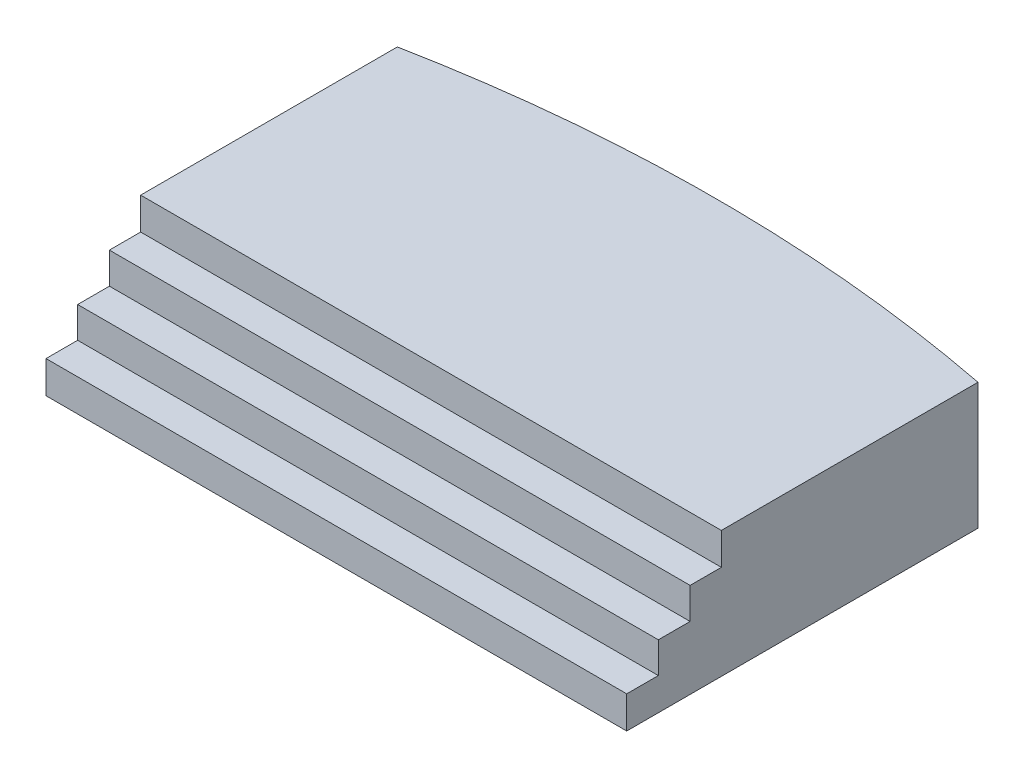
ISO-10303-21;
HEADER;
FILE_DESCRIPTION(('STEP AP214'),'2;1');
FILE_NAME('part.step','',(''),(''),'','','');
FILE_SCHEMA(('AUTOMOTIVE_DESIGN { 1 0 10303 214 1 1 1 1 }'));
ENDSEC;
DATA;
#1=APPLICATION_CONTEXT('core data for automotive mechanical design processes');
#2=APPLICATION_PROTOCOL_DEFINITION('international standard','automotive_design',2000,#1);
#3=PRODUCT_CONTEXT('',#1,'mechanical');
#4=PRODUCT('Part','Part','',(#3));
#5=PRODUCT_RELATED_PRODUCT_CATEGORY('part','',(#4));
#6=PRODUCT_DEFINITION_FORMATION('','',#4);
#7=PRODUCT_DEFINITION_CONTEXT('part definition',#1,'design');
#8=PRODUCT_DEFINITION('design','',#6,#7);
#9=PRODUCT_DEFINITION_SHAPE('','',#8);
#10=(LENGTH_UNIT() NAMED_UNIT(*) SI_UNIT(.MILLI.,.METRE.));
#11=(NAMED_UNIT(*) PLANE_ANGLE_UNIT() SI_UNIT($,.RADIAN.));
#12=(NAMED_UNIT(*) SI_UNIT($,.STERADIAN.) SOLID_ANGLE_UNIT());
#13=UNCERTAINTY_MEASURE_WITH_UNIT(LENGTH_MEASURE(1.E-05),#10,'distance_accuracy_value','');
#14=(GEOMETRIC_REPRESENTATION_CONTEXT(3) GLOBAL_UNCERTAINTY_ASSIGNED_CONTEXT((#13)) GLOBAL_UNIT_ASSIGNED_CONTEXT((#10,
#11,#12)) REPRESENTATION_CONTEXT('',''));
#15=CARTESIAN_POINT('',(0.,0.,0.));
#16=DIRECTION('',(0.,0.,1.));
#17=DIRECTION('',(1.,0.,0.));
#18=AXIS2_PLACEMENT_3D('',#15,#16,#17);
#19=CARTESIAN_POINT('',(-4067.11617207082,1000.,-9000.));
#20=DIRECTION('',(0.,0.,-1.));
#21=DIRECTION('',(-1.,0.,0.));
#22=AXIS2_PLACEMENT_3D('',#19,#20,#21);
#23=PLANE('',#22);
#24=DIRECTION('',(0.,1.,0.));
#25=VECTOR('',#24,1.);
#26=CARTESIAN_POINT('',(2296.3939,-2000.,-9000.));
#27=LINE('',#26,#25);
#28=CARTESIAN_POINT('',(2296.3939,0.,-9000.));
#29=VERTEX_POINT('',#28);
#30=CARTESIAN_POINT('',(2296.3939,254.910429711032,-9000.));
#31=VERTEX_POINT('',#30);
#32=EDGE_CURVE('E118',#29,#31,#27,.T.);
#33=ORIENTED_EDGE('',*,*,#32,.T.);
#34=DIRECTION('',(1.,0.,0.));
#35=VECTOR('',#34,1.);
#36=CARTESIAN_POINT('',(-20135.8766380256,254.910429711032,-9000.));
#37=LINE('',#36,#35);
#38=CARTESIAN_POINT('',(-2296.3939,254.910429711032,-9000.));
#39=VERTEX_POINT('',#38);
#40=EDGE_CURVE('E139',#39,#31,#37,.T.);
#41=ORIENTED_EDGE('',*,*,#40,.F.);
#42=DIRECTION('',(0.,1.,0.));
#43=VECTOR('',#42,1.);
#44=CARTESIAN_POINT('',(-2296.3939,-2000.,-9000.));
#45=LINE('',#44,#43);
#46=CARTESIAN_POINT('',(-2296.3939,0.,-9000.));
#47=VERTEX_POINT('',#46);
#48=EDGE_CURVE('E66',#47,#39,#45,.T.);
#49=ORIENTED_EDGE('',*,*,#48,.F.);
#50=DIRECTION('',(1.,0.,0.));
#51=VECTOR('',#50,1.);
#52=CARTESIAN_POINT('',(-4067.11617207082,0.,-9000.));
#53=LINE('',#52,#51);
#54=EDGE_CURVE('E135',#47,#29,#53,.T.);
#55=ORIENTED_EDGE('',*,*,#54,.T.);
#56=EDGE_LOOP('',(#33,#41,#49,#55));
#57=FACE_BOUND('',#56,.T.);
#58=ADVANCED_FACE('F44',(#57),#23,.F.);
#59=CARTESIAN_POINT('',(0.,1000.,8.70414851306123E-11));
#60=DIRECTION('',(0.,-1.,0.));
#61=DIRECTION('',(0.,0.,-1.));
#62=AXIS2_PLACEMENT_3D('',#59,#60,#61);
#63=CYLINDRICAL_SURFACE('',#62,12000.0000000001);
#64=CARTESIAN_POINT('',(0.,1000.,-2.8421709430404E-11));
#65=DIRECTION('',(0.,1.,0.));
#66=DIRECTION('',(0.,0.,1.));
#67=AXIS2_PLACEMENT_3D('',#64,#65,#66);
#68=CIRCLE('',#67,12000.);
#69=CARTESIAN_POINT('',(2296.3939,1000.,-11778.2246139239));
#70=VERTEX_POINT('',#69);
#71=CARTESIAN_POINT('',(-2296.3939,1000.,-11778.2246139239));
#72=VERTEX_POINT('',#71);
#73=EDGE_CURVE('E147',#70,#72,#68,.T.);
#74=ORIENTED_EDGE('',*,*,#73,.F.);
#75=DIRECTION('',(0.,-1.,0.));
#76=VECTOR('',#75,1.);
#77=CARTESIAN_POINT('',(2296.3939,1000.,-11778.2246139239));
#78=LINE('',#77,#76);
#79=CARTESIAN_POINT('',(2296.3939,1.11022302462516E-13,-11778.2246139239));
#80=VERTEX_POINT('',#79);
#81=EDGE_CURVE('E140',#70,#80,#78,.T.);
#82=ORIENTED_EDGE('',*,*,#81,.T.);
#83=CARTESIAN_POINT('',(0.,0.,8.70414851306123E-11));
#84=DIRECTION('',(0.,-1.,0.));
#85=DIRECTION('',(0.,0.,-1.));
#86=AXIS2_PLACEMENT_3D('',#83,#84,#85);
#87=CIRCLE('',#86,12000.0000000001);
#88=CARTESIAN_POINT('',(-2296.3939,1.11022302462516E-13,-11778.2246139239));
#89=VERTEX_POINT('',#88);
#90=EDGE_CURVE('E137',#89,#80,#87,.T.);
#91=ORIENTED_EDGE('',*,*,#90,.F.);
#92=DIRECTION('',(0.,-1.,0.));
#93=VECTOR('',#92,1.);
#94=CARTESIAN_POINT('',(-2296.3939,1000.,-11778.2246139239));
#95=LINE('',#94,#93);
#96=EDGE_CURVE('E211',#89,#72,#95,.F.);
#97=ORIENTED_EDGE('',*,*,#96,.T.);
#98=EDGE_LOOP('',(#74,#82,#91,#97));
#99=FACE_BOUND('',#98,.T.);
#100=ADVANCED_FACE('F255',(#99),#63,.T.);
#101=CARTESIAN_POINT('',(0.,1000.,-2.8421709430404E-11));
#102=DIRECTION('',(0.,1.,0.));
#103=DIRECTION('',(0.,0.,1.));
#104=AXIS2_PLACEMENT_3D('',#101,#102,#103);
#105=PLANE('',#104);
#106=DIRECTION('',(-1.,0.,0.));
#107=VECTOR('',#106,1.);
#108=CARTESIAN_POINT('',(0.,1000.,-9748.52702002299));
#109=LINE('',#108,#107);
#110=CARTESIAN_POINT('',(2296.3939,1000.,-9748.52702002299));
#111=VERTEX_POINT('',#110);
#112=CARTESIAN_POINT('',(-2296.3939,1000.,-9748.52702002299));
#113=VERTEX_POINT('',#112);
#114=EDGE_CURVE('E155',#111,#113,#109,.T.);
#115=ORIENTED_EDGE('',*,*,#114,.F.);
#116=DIRECTION('',(0.,0.,-1.));
#117=VECTOR('',#116,1.);
#118=CARTESIAN_POINT('',(2296.3939,1000.,-2.8421709430404E-11));
#119=LINE('',#118,#117);
#120=EDGE_CURVE('E190',#111,#70,#119,.T.);
#121=ORIENTED_EDGE('',*,*,#120,.T.);
#122=ORIENTED_EDGE('',*,*,#73,.T.);
#123=DIRECTION('',(0.,0.,1.));
#124=VECTOR('',#123,1.);
#125=CARTESIAN_POINT('',(-2296.3939,1000.,-2.8421709430404E-11));
#126=LINE('',#125,#124);
#127=EDGE_CURVE('E215',#72,#113,#126,.T.);
#128=ORIENTED_EDGE('',*,*,#127,.T.);
#129=EDGE_LOOP('',(#115,#121,#122,#128));
#130=FACE_BOUND('',#129,.T.);
#131=ADVANCED_FACE('F251',(#130),#105,.T.);
#132=CARTESIAN_POINT('',(0.,0.,-2.8421709430404E-11));
#133=DIRECTION('',(0.,1.,0.));
#134=DIRECTION('',(0.,0.,1.));
#135=AXIS2_PLACEMENT_3D('',#132,#133,#134);
#136=PLANE('',#135);
#137=DIRECTION('',(0.,0.,-1.));
#138=VECTOR('',#137,1.);
#139=CARTESIAN_POINT('',(2296.3939,0.,-2.8421709430404E-11));
#140=LINE('',#139,#138);
#141=EDGE_CURVE('E121',#29,#80,#140,.T.);
#142=ORIENTED_EDGE('',*,*,#141,.F.);
#143=ORIENTED_EDGE('',*,*,#54,.F.);
#144=DIRECTION('',(0.,0.,1.));
#145=VECTOR('',#144,1.);
#146=CARTESIAN_POINT('',(-2296.3939,0.,-2.8421709430404E-11));
#147=LINE('',#146,#145);
#148=EDGE_CURVE('E208',#89,#47,#147,.T.);
#149=ORIENTED_EDGE('',*,*,#148,.F.);
#150=ORIENTED_EDGE('',*,*,#90,.T.);
#151=EDGE_LOOP('',(#142,#143,#149,#150));
#152=FACE_BOUND('',#151,.T.);
#153=ADVANCED_FACE('F133',(#152),#136,.F.);
#154=CARTESIAN_POINT('',(-20135.8766380256,747.115103927776,-9748.52702002299));
#155=DIRECTION('',(0.,0.,-1.));
#156=DIRECTION('',(-1.,0.,0.));
#157=AXIS2_PLACEMENT_3D('',#154,#155,#156);
#158=PLANE('',#157);
#159=DIRECTION('',(0.,-1.,0.));
#160=VECTOR('',#159,1.);
#161=CARTESIAN_POINT('',(2296.3939,747.115103927776,-9748.52702002299));
#162=LINE('',#161,#160);
#163=CARTESIAN_POINT('',(2296.3939,747.115103927776,-9748.52702002299));
#164=VERTEX_POINT('',#163);
#165=EDGE_CURVE('E194',#111,#164,#162,.T.);
#166=ORIENTED_EDGE('',*,*,#165,.F.);
#167=ORIENTED_EDGE('',*,*,#114,.T.);
#168=DIRECTION('',(0.,1.,0.));
#169=VECTOR('',#168,1.);
#170=CARTESIAN_POINT('',(-2296.3939,747.115103927776,-9748.52702002299));
#171=LINE('',#170,#169);
#172=CARTESIAN_POINT('',(-2296.3939,747.115103927776,-9748.52702002299));
#173=VERTEX_POINT('',#172);
#174=EDGE_CURVE('E219',#173,#113,#171,.T.);
#175=ORIENTED_EDGE('',*,*,#174,.F.);
#176=DIRECTION('',(1.,0.,0.));
#177=VECTOR('',#176,1.);
#178=CARTESIAN_POINT('',(-20135.8766380256,747.115103927776,-9748.52702002299));
#179=LINE('',#178,#177);
#180=EDGE_CURVE('E143',#173,#164,#179,.T.);
#181=ORIENTED_EDGE('',*,*,#180,.T.);
#182=EDGE_LOOP('',(#166,#167,#175,#181));
#183=FACE_BOUND('',#182,.T.);
#184=ADVANCED_FACE('F248',(#183),#158,.F.);
#185=CARTESIAN_POINT('',(-20135.8766380256,747.115103927776,-9501.41191609525));
#186=DIRECTION('',(0.,-1.,0.));
#187=DIRECTION('',(0.,0.,-1.));
#188=AXIS2_PLACEMENT_3D('',#185,#186,#187);
#189=PLANE('',#188);
#190=DIRECTION('',(0.,0.,1.));
#191=VECTOR('',#190,1.);
#192=CARTESIAN_POINT('',(2296.3939,747.115103927776,-9501.41191609525));
#193=LINE('',#192,#191);
#194=CARTESIAN_POINT('',(2296.3939,747.115103927776,-9501.41191609525));
#195=VERTEX_POINT('',#194);
#196=EDGE_CURVE('E197',#164,#195,#193,.T.);
#197=ORIENTED_EDGE('',*,*,#196,.F.);
#198=ORIENTED_EDGE('',*,*,#180,.F.);
#199=DIRECTION('',(0.,0.,-1.));
#200=VECTOR('',#199,1.);
#201=CARTESIAN_POINT('',(-2296.3939,747.115103927776,-9501.41191609525));
#202=LINE('',#201,#200);
#203=CARTESIAN_POINT('',(-2296.3939,747.115103927776,-9501.41191609525));
#204=VERTEX_POINT('',#203);
#205=EDGE_CURVE('E222',#204,#173,#202,.T.);
#206=ORIENTED_EDGE('',*,*,#205,.F.);
#207=DIRECTION('',(1.,0.,0.));
#208=VECTOR('',#207,1.);
#209=CARTESIAN_POINT('',(-20135.8766380256,747.115103927776,-9501.41191609525));
#210=LINE('',#209,#208);
#211=EDGE_CURVE('E150',#204,#195,#210,.T.);
#212=ORIENTED_EDGE('',*,*,#211,.T.);
#213=EDGE_LOOP('',(#197,#198,#206,#212));
#214=FACE_BOUND('',#213,.T.);
#215=ADVANCED_FACE('F243',(#214),#189,.F.);
#216=CARTESIAN_POINT('',(-20135.8766380256,500.,-9501.41191609525));
#217=DIRECTION('',(0.,0.,-1.));
#218=DIRECTION('',(-1.,0.,0.));
#219=AXIS2_PLACEMENT_3D('',#216,#217,#218);
#220=PLANE('',#219);
#221=DIRECTION('',(0.,-1.,0.));
#222=VECTOR('',#221,1.);
#223=CARTESIAN_POINT('',(2296.3939,500.,-9501.41191609525));
#224=LINE('',#223,#222);
#225=CARTESIAN_POINT('',(2296.3939,500.,-9501.41191609525));
#226=VERTEX_POINT('',#225);
#227=EDGE_CURVE('E200',#195,#226,#224,.T.);
#228=ORIENTED_EDGE('',*,*,#227,.F.);
#229=ORIENTED_EDGE('',*,*,#211,.F.);
#230=DIRECTION('',(0.,1.,0.));
#231=VECTOR('',#230,1.);
#232=CARTESIAN_POINT('',(-2296.3939,500.,-9501.41191609525));
#233=LINE('',#232,#231);
#234=CARTESIAN_POINT('',(-2296.3939,500.,-9501.41191609525));
#235=VERTEX_POINT('',#234);
#236=EDGE_CURVE('E225',#235,#204,#233,.T.);
#237=ORIENTED_EDGE('',*,*,#236,.F.);
#238=DIRECTION('',(1.,0.,0.));
#239=VECTOR('',#238,1.);
#240=CARTESIAN_POINT('',(-20135.8766380256,500.,-9501.41191609525));
#241=LINE('',#240,#239);
#242=EDGE_CURVE('E179',#235,#226,#241,.T.);
#243=ORIENTED_EDGE('',*,*,#242,.T.);
#244=EDGE_LOOP('',(#228,#229,#237,#243));
#245=FACE_BOUND('',#244,.T.);
#246=ADVANCED_FACE('F238',(#245),#220,.F.);
#247=CARTESIAN_POINT('',(-20135.8766380256,500.,-9250.24574488999));
#248=DIRECTION('',(0.,-1.,0.));
#249=DIRECTION('',(0.,0.,-1.));
#250=AXIS2_PLACEMENT_3D('',#247,#248,#249);
#251=PLANE('',#250);
#252=DIRECTION('',(0.,0.,1.));
#253=VECTOR('',#252,1.);
#254=CARTESIAN_POINT('',(2296.3939,500.,-9250.24574488999));
#255=LINE('',#254,#253);
#256=CARTESIAN_POINT('',(2296.3939,500.,-9250.24574488999));
#257=VERTEX_POINT('',#256);
#258=EDGE_CURVE('E203',#226,#257,#255,.T.);
#259=ORIENTED_EDGE('',*,*,#258,.F.);
#260=ORIENTED_EDGE('',*,*,#242,.F.);
#261=DIRECTION('',(0.,0.,-1.));
#262=VECTOR('',#261,1.);
#263=CARTESIAN_POINT('',(-2296.3939,500.,-9250.24574488999));
#264=LINE('',#263,#262);
#265=CARTESIAN_POINT('',(-2296.3939,500.,-9250.24574488999));
#266=VERTEX_POINT('',#265);
#267=EDGE_CURVE('E172',#266,#235,#264,.T.);
#268=ORIENTED_EDGE('',*,*,#267,.F.);
#269=DIRECTION('',(1.,0.,0.));
#270=VECTOR('',#269,1.);
#271=CARTESIAN_POINT('',(-20135.8766380256,500.,-9250.24574488999));
#272=LINE('',#271,#270);
#273=EDGE_CURVE('E170',#266,#257,#272,.T.);
#274=ORIENTED_EDGE('',*,*,#273,.T.);
#275=EDGE_LOOP('',(#259,#260,#268,#274));
#276=FACE_BOUND('',#275,.T.);
#277=ADVANCED_FACE('F240',(#276),#251,.F.);
#278=CARTESIAN_POINT('',(-20135.8766380256,254.910429711032,-9250.24574488999));
#279=DIRECTION('',(0.,0.,-1.));
#280=DIRECTION('',(-1.,0.,0.));
#281=AXIS2_PLACEMENT_3D('',#278,#279,#280);
#282=PLANE('',#281);
#283=DIRECTION('',(0.,-1.,0.));
#284=VECTOR('',#283,1.);
#285=CARTESIAN_POINT('',(2296.3939,254.910429711032,-9250.24574488999));
#286=LINE('',#285,#284);
#287=CARTESIAN_POINT('',(2296.3939,254.910429711032,-9250.24574488999));
#288=VERTEX_POINT('',#287);
#289=EDGE_CURVE('E58',#257,#288,#286,.T.);
#290=ORIENTED_EDGE('',*,*,#289,.F.);
#291=ORIENTED_EDGE('',*,*,#273,.F.);
#292=DIRECTION('',(0.,1.,0.));
#293=VECTOR('',#292,1.);
#294=CARTESIAN_POINT('',(-2296.3939,254.910429711032,-9250.24574488999));
#295=LINE('',#294,#293);
#296=CARTESIAN_POINT('',(-2296.3939,254.910429711032,-9250.24574488999));
#297=VERTEX_POINT('',#296);
#298=EDGE_CURVE('E128',#297,#266,#295,.T.);
#299=ORIENTED_EDGE('',*,*,#298,.F.);
#300=DIRECTION('',(1.,0.,0.));
#301=VECTOR('',#300,1.);
#302=CARTESIAN_POINT('',(-20135.8766380256,254.910429711032,-9250.24574488999));
#303=LINE('',#302,#301);
#304=EDGE_CURVE('E168',#297,#288,#303,.T.);
#305=ORIENTED_EDGE('',*,*,#304,.T.);
#306=EDGE_LOOP('',(#290,#291,#299,#305));
#307=FACE_BOUND('',#306,.T.);
#308=ADVANCED_FACE('F167',(#307),#282,.F.);
#309=CARTESIAN_POINT('',(-20135.8766380256,254.910429711032,-9000.));
#310=DIRECTION('',(0.,-1.,0.));
#311=DIRECTION('',(0.,0.,-1.));
#312=AXIS2_PLACEMENT_3D('',#309,#310,#311);
#313=PLANE('',#312);
#314=DIRECTION('',(0.,0.,1.));
#315=VECTOR('',#314,1.);
#316=CARTESIAN_POINT('',(2296.3939,254.910429711032,-9000.));
#317=LINE('',#316,#315);
#318=EDGE_CURVE('E11',#288,#31,#317,.T.);
#319=ORIENTED_EDGE('',*,*,#318,.F.);
#320=ORIENTED_EDGE('',*,*,#304,.F.);
#321=DIRECTION('',(0.,0.,-1.));
#322=VECTOR('',#321,1.);
#323=CARTESIAN_POINT('',(-2296.3939,254.910429711032,-9000.));
#324=LINE('',#323,#322);
#325=EDGE_CURVE('E52',#39,#297,#324,.T.);
#326=ORIENTED_EDGE('',*,*,#325,.F.);
#327=ORIENTED_EDGE('',*,*,#40,.T.);
#328=EDGE_LOOP('',(#319,#320,#326,#327));
#329=FACE_BOUND('',#328,.T.);
#330=ADVANCED_FACE('F174',(#329),#313,.F.);
#331=CARTESIAN_POINT('',(-2296.3939,-2000.,-12199.1971318719));
#332=DIRECTION('',(-1.,0.,0.));
#333=DIRECTION('',(0.,0.,1.));
#334=AXIS2_PLACEMENT_3D('',#331,#332,#333);
#335=PLANE('',#334);
#336=ORIENTED_EDGE('',*,*,#148,.T.);
#337=ORIENTED_EDGE('',*,*,#48,.T.);
#338=ORIENTED_EDGE('',*,*,#325,.T.);
#339=ORIENTED_EDGE('',*,*,#298,.T.);
#340=ORIENTED_EDGE('',*,*,#267,.T.);
#341=ORIENTED_EDGE('',*,*,#236,.T.);
#342=ORIENTED_EDGE('',*,*,#205,.T.);
#343=ORIENTED_EDGE('',*,*,#174,.T.);
#344=ORIENTED_EDGE('',*,*,#127,.F.);
#345=ORIENTED_EDGE('',*,*,#96,.F.);
#346=EDGE_LOOP('',(#336,#337,#338,#339,#340,#341,#342,#343,#344,#345));
#347=FACE_BOUND('',#346,.T.);
#348=ADVANCED_FACE('F160',(#347),#335,.T.);
#349=CARTESIAN_POINT('',(2296.3939,-2000.,-12199.1971318719));
#350=DIRECTION('',(1.,0.,0.));
#351=DIRECTION('',(0.,0.,-1.));
#352=AXIS2_PLACEMENT_3D('',#349,#350,#351);
#353=PLANE('',#352);
#354=ORIENTED_EDGE('',*,*,#141,.T.);
#355=ORIENTED_EDGE('',*,*,#81,.F.);
#356=ORIENTED_EDGE('',*,*,#120,.F.);
#357=ORIENTED_EDGE('',*,*,#165,.T.);
#358=ORIENTED_EDGE('',*,*,#196,.T.);
#359=ORIENTED_EDGE('',*,*,#227,.T.);
#360=ORIENTED_EDGE('',*,*,#258,.T.);
#361=ORIENTED_EDGE('',*,*,#289,.T.);
#362=ORIENTED_EDGE('',*,*,#318,.T.);
#363=ORIENTED_EDGE('',*,*,#32,.F.);
#364=EDGE_LOOP('',(#354,#355,#356,#357,#358,#359,#360,#361,#362,#363));
#365=FACE_BOUND('',#364,.T.);
#366=ADVANCED_FACE('F120',(#365),#353,.T.);
#367=CLOSED_SHELL('',(#58,#100,#131,#153,#184,#215,#246,#277,#308,#330,#348,#366));
#368=MANIFOLD_SOLID_BREP('B2',#367);
#369=ADVANCED_BREP_SHAPE_REPRESENTATION('',(#18,#368),#14);
#370=SHAPE_DEFINITION_REPRESENTATION(#9,#369);
ENDSEC;
END-ISO-10303-21;
